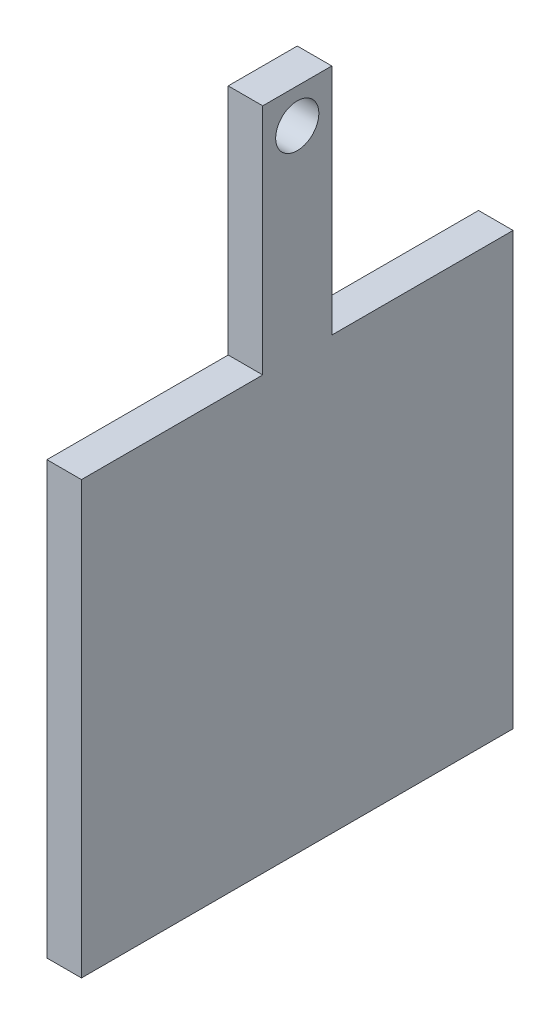
ISO-10303-21;
HEADER;
FILE_DESCRIPTION(('STEP AP214'),'2;1');
FILE_NAME('part.step','',(''),(''),'','','');
FILE_SCHEMA(('AUTOMOTIVE_DESIGN { 1 0 10303 214 1 1 1 1 }'));
ENDSEC;
DATA;
#1=APPLICATION_CONTEXT('core data for automotive mechanical design processes');
#2=APPLICATION_PROTOCOL_DEFINITION('international standard','automotive_design',2000,#1);
#3=PRODUCT_CONTEXT('',#1,'mechanical');
#4=PRODUCT('Part','Part','',(#3));
#5=PRODUCT_RELATED_PRODUCT_CATEGORY('part','',(#4));
#6=PRODUCT_DEFINITION_FORMATION('','',#4);
#7=PRODUCT_DEFINITION_CONTEXT('part definition',#1,'design');
#8=PRODUCT_DEFINITION('design','',#6,#7);
#9=PRODUCT_DEFINITION_SHAPE('','',#8);
#10=(LENGTH_UNIT() NAMED_UNIT(*) SI_UNIT(.MILLI.,.METRE.));
#11=(NAMED_UNIT(*) PLANE_ANGLE_UNIT() SI_UNIT($,.RADIAN.));
#12=(NAMED_UNIT(*) SI_UNIT($,.STERADIAN.) SOLID_ANGLE_UNIT());
#13=UNCERTAINTY_MEASURE_WITH_UNIT(LENGTH_MEASURE(1.E-05),#10,'distance_accuracy_value','');
#14=(GEOMETRIC_REPRESENTATION_CONTEXT(3) GLOBAL_UNCERTAINTY_ASSIGNED_CONTEXT((#13)) GLOBAL_UNIT_ASSIGNED_CONTEXT((#10,
#11,#12)) REPRESENTATION_CONTEXT('',''));
#15=CARTESIAN_POINT('',(0.,0.,0.));
#16=DIRECTION('',(0.,0.,1.));
#17=DIRECTION('',(1.,0.,0.));
#18=AXIS2_PLACEMENT_3D('',#15,#16,#17);
#19=CARTESIAN_POINT('',(4.,0.,0.));
#20=DIRECTION('',(1.,0.,0.));
#21=DIRECTION('',(0.,0.,-1.));
#22=AXIS2_PLACEMENT_3D('',#19,#20,#21);
#23=PLANE('',#22);
#24=DIRECTION('',(0.,0.,1.));
#25=VECTOR('',#24,1.);
#26=CARTESIAN_POINT('',(4.,0.,21.));
#27=LINE('',#26,#25);
#28=CARTESIAN_POINT('',(4.,0.,0.));
#29=VERTEX_POINT('',#28);
#30=CARTESIAN_POINT('',(4.,0.,21.));
#31=VERTEX_POINT('',#30);
#32=EDGE_CURVE('E144',#29,#31,#27,.T.);
#33=ORIENTED_EDGE('',*,*,#32,.T.);
#34=DIRECTION('',(0.,-1.,0.));
#35=VECTOR('',#34,1.);
#36=CARTESIAN_POINT('',(4.,-50.,21.));
#37=LINE('',#36,#35);
#38=CARTESIAN_POINT('',(4.,-50.,21.));
#39=VERTEX_POINT('',#38);
#40=EDGE_CURVE('E92',#31,#39,#37,.T.);
#41=ORIENTED_EDGE('',*,*,#40,.T.);
#42=DIRECTION('',(0.,0.,-1.));
#43=VECTOR('',#42,1.);
#44=CARTESIAN_POINT('',(4.,-50.,-29.));
#45=LINE('',#44,#43);
#46=CARTESIAN_POINT('',(4.,-50.,-29.));
#47=VERTEX_POINT('',#46);
#48=EDGE_CURVE('E159',#39,#47,#45,.T.);
#49=ORIENTED_EDGE('',*,*,#48,.T.);
#50=DIRECTION('',(0.,1.,0.));
#51=VECTOR('',#50,1.);
#52=CARTESIAN_POINT('',(4.,0.,-29.));
#53=LINE('',#52,#51);
#54=CARTESIAN_POINT('',(4.,0.,-29.));
#55=VERTEX_POINT('',#54);
#56=EDGE_CURVE('E172',#47,#55,#53,.T.);
#57=ORIENTED_EDGE('',*,*,#56,.T.);
#58=DIRECTION('',(0.,0.,1.));
#59=VECTOR('',#58,1.);
#60=CARTESIAN_POINT('',(4.,0.,-8.));
#61=LINE('',#60,#59);
#62=CARTESIAN_POINT('',(4.,0.,-8.));
#63=VERTEX_POINT('',#62);
#64=EDGE_CURVE('E111',#55,#63,#61,.T.);
#65=ORIENTED_EDGE('',*,*,#64,.T.);
#66=DIRECTION('',(0.,1.,0.));
#67=VECTOR('',#66,1.);
#68=CARTESIAN_POINT('',(4.,27.,-8.));
#69=LINE('',#68,#67);
#70=CARTESIAN_POINT('',(4.,27.,-8.));
#71=VERTEX_POINT('',#70);
#72=EDGE_CURVE('E105',#63,#71,#69,.T.);
#73=ORIENTED_EDGE('',*,*,#72,.T.);
#74=DIRECTION('',(0.,0.,1.));
#75=VECTOR('',#74,1.);
#76=CARTESIAN_POINT('',(4.,27.,0.));
#77=LINE('',#76,#75);
#78=CARTESIAN_POINT('',(4.,27.,0.));
#79=VERTEX_POINT('',#78);
#80=EDGE_CURVE('E109',#71,#79,#77,.T.);
#81=ORIENTED_EDGE('',*,*,#80,.T.);
#82=DIRECTION('',(0.,-1.,0.));
#83=VECTOR('',#82,1.);
#84=CARTESIAN_POINT('',(4.,0.,0.));
#85=LINE('',#84,#83);
#86=EDGE_CURVE('E49',#79,#29,#85,.T.);
#87=ORIENTED_EDGE('',*,*,#86,.T.);
#88=EDGE_LOOP('',(#33,#41,#49,#57,#65,#73,#81,#87));
#89=FACE_BOUND('',#88,.T.);
#90=CARTESIAN_POINT('',(4.,23.,-4.));
#91=DIRECTION('',(1.,0.,0.));
#92=DIRECTION('',(0.,0.,-1.));
#93=AXIS2_PLACEMENT_3D('',#90,#91,#92);
#94=CIRCLE('',#93,2.5);
#95=CARTESIAN_POINT('',(4.,23.,-6.5));
#96=VERTEX_POINT('',#95);
#97=EDGE_CURVE('E133',#96,#96,#94,.T.);
#98=ORIENTED_EDGE('',*,*,#97,.F.);
#99=EDGE_LOOP('',(#98));
#100=FACE_BOUND('',#99,.T.);
#101=ADVANCED_FACE('F32',(#89,#100),#23,.T.);
#102=CARTESIAN_POINT('',(0.,0.,0.));
#103=DIRECTION('',(1.,0.,0.));
#104=DIRECTION('',(0.,0.,-1.));
#105=AXIS2_PLACEMENT_3D('',#102,#103,#104);
#106=PLANE('',#105);
#107=DIRECTION('',(0.,0.,1.));
#108=VECTOR('',#107,1.);
#109=CARTESIAN_POINT('',(0.,0.,21.));
#110=LINE('',#109,#108);
#111=CARTESIAN_POINT('',(0.,0.,0.));
#112=VERTEX_POINT('',#111);
#113=CARTESIAN_POINT('',(0.,0.,21.));
#114=VERTEX_POINT('',#113);
#115=EDGE_CURVE('E129',#112,#114,#110,.T.);
#116=ORIENTED_EDGE('',*,*,#115,.F.);
#117=DIRECTION('',(0.,-1.,0.));
#118=VECTOR('',#117,1.);
#119=CARTESIAN_POINT('',(0.,0.,0.));
#120=LINE('',#119,#118);
#121=CARTESIAN_POINT('',(0.,27.,0.));
#122=VERTEX_POINT('',#121);
#123=EDGE_CURVE('E84',#122,#112,#120,.T.);
#124=ORIENTED_EDGE('',*,*,#123,.F.);
#125=DIRECTION('',(0.,0.,1.));
#126=VECTOR('',#125,1.);
#127=CARTESIAN_POINT('',(0.,27.,0.));
#128=LINE('',#127,#126);
#129=CARTESIAN_POINT('',(0.,27.,-8.));
#130=VERTEX_POINT('',#129);
#131=EDGE_CURVE('E78',#130,#122,#128,.T.);
#132=ORIENTED_EDGE('',*,*,#131,.F.);
#133=DIRECTION('',(0.,1.,0.));
#134=VECTOR('',#133,1.);
#135=CARTESIAN_POINT('',(0.,27.,-8.));
#136=LINE('',#135,#134);
#137=CARTESIAN_POINT('',(0.,0.,-8.));
#138=VERTEX_POINT('',#137);
#139=EDGE_CURVE('E119',#138,#130,#136,.T.);
#140=ORIENTED_EDGE('',*,*,#139,.F.);
#141=DIRECTION('',(0.,0.,1.));
#142=VECTOR('',#141,1.);
#143=CARTESIAN_POINT('',(0.,0.,-8.));
#144=LINE('',#143,#142);
#145=CARTESIAN_POINT('',(0.,0.,-29.));
#146=VERTEX_POINT('',#145);
#147=EDGE_CURVE('E139',#146,#138,#144,.T.);
#148=ORIENTED_EDGE('',*,*,#147,.F.);
#149=DIRECTION('',(0.,1.,0.));
#150=VECTOR('',#149,1.);
#151=CARTESIAN_POINT('',(0.,0.,-29.));
#152=LINE('',#151,#150);
#153=CARTESIAN_POINT('',(0.,-50.,-29.));
#154=VERTEX_POINT('',#153);
#155=EDGE_CURVE('E137',#154,#146,#152,.T.);
#156=ORIENTED_EDGE('',*,*,#155,.F.);
#157=DIRECTION('',(0.,0.,-1.));
#158=VECTOR('',#157,1.);
#159=CARTESIAN_POINT('',(0.,-50.,-29.));
#160=LINE('',#159,#158);
#161=CARTESIAN_POINT('',(0.,-50.,21.));
#162=VERTEX_POINT('',#161);
#163=EDGE_CURVE('E135',#162,#154,#160,.T.);
#164=ORIENTED_EDGE('',*,*,#163,.F.);
#165=DIRECTION('',(0.,-1.,0.));
#166=VECTOR('',#165,1.);
#167=CARTESIAN_POINT('',(0.,-50.,21.));
#168=LINE('',#167,#166);
#169=EDGE_CURVE('E132',#114,#162,#168,.T.);
#170=ORIENTED_EDGE('',*,*,#169,.F.);
#171=EDGE_LOOP('',(#116,#124,#132,#140,#148,#156,#164,#170));
#172=FACE_BOUND('',#171,.T.);
#173=CARTESIAN_POINT('',(0.,23.,-4.));
#174=DIRECTION('',(1.,0.,0.));
#175=DIRECTION('',(0.,0.,-1.));
#176=AXIS2_PLACEMENT_3D('',#173,#174,#175);
#177=CIRCLE('',#176,2.5);
#178=CARTESIAN_POINT('',(0.,23.,-6.5));
#179=VERTEX_POINT('',#178);
#180=EDGE_CURVE('E178',#179,#179,#177,.T.);
#181=ORIENTED_EDGE('',*,*,#180,.T.);
#182=EDGE_LOOP('',(#181));
#183=FACE_BOUND('',#182,.T.);
#184=ADVANCED_FACE('F163',(#172,#183),#106,.F.);
#185=CARTESIAN_POINT('',(4.,0.,21.));
#186=DIRECTION('',(0.,-1.,0.));
#187=DIRECTION('',(0.,0.,-1.));
#188=AXIS2_PLACEMENT_3D('',#185,#186,#187);
#189=PLANE('',#188);
#190=ORIENTED_EDGE('',*,*,#115,.T.);
#191=DIRECTION('',(-1.,0.,0.));
#192=VECTOR('',#191,1.);
#193=CARTESIAN_POINT('',(4.,0.,21.));
#194=LINE('',#193,#192);
#195=EDGE_CURVE('E11',#31,#114,#194,.T.);
#196=ORIENTED_EDGE('',*,*,#195,.F.);
#197=ORIENTED_EDGE('',*,*,#32,.F.);
#198=DIRECTION('',(-1.,0.,0.));
#199=VECTOR('',#198,1.);
#200=CARTESIAN_POINT('',(4.,0.,0.));
#201=LINE('',#200,#199);
#202=EDGE_CURVE('E125',#29,#112,#201,.T.);
#203=ORIENTED_EDGE('',*,*,#202,.T.);
#204=EDGE_LOOP('',(#190,#196,#197,#203));
#205=FACE_BOUND('',#204,.T.);
#206=ADVANCED_FACE('F34',(#205),#189,.F.);
#207=CARTESIAN_POINT('',(4.,-50.,21.));
#208=DIRECTION('',(0.,0.,-1.));
#209=DIRECTION('',(-1.,0.,0.));
#210=AXIS2_PLACEMENT_3D('',#207,#208,#209);
#211=PLANE('',#210);
#212=ORIENTED_EDGE('',*,*,#169,.T.);
#213=DIRECTION('',(-1.,0.,0.));
#214=VECTOR('',#213,1.);
#215=CARTESIAN_POINT('',(4.,-50.,21.));
#216=LINE('',#215,#214);
#217=EDGE_CURVE('E41',#39,#162,#216,.T.);
#218=ORIENTED_EDGE('',*,*,#217,.F.);
#219=ORIENTED_EDGE('',*,*,#40,.F.);
#220=ORIENTED_EDGE('',*,*,#195,.T.);
#221=EDGE_LOOP('',(#212,#218,#219,#220));
#222=FACE_BOUND('',#221,.T.);
#223=ADVANCED_FACE('F206',(#222),#211,.F.);
#224=CARTESIAN_POINT('',(4.,-50.,-29.));
#225=DIRECTION('',(0.,1.,0.));
#226=DIRECTION('',(0.,0.,1.));
#227=AXIS2_PLACEMENT_3D('',#224,#225,#226);
#228=PLANE('',#227);
#229=ORIENTED_EDGE('',*,*,#163,.T.);
#230=DIRECTION('',(-1.,0.,0.));
#231=VECTOR('',#230,1.);
#232=CARTESIAN_POINT('',(4.,-50.,-29.));
#233=LINE('',#232,#231);
#234=EDGE_CURVE('E151',#47,#154,#233,.T.);
#235=ORIENTED_EDGE('',*,*,#234,.F.);
#236=ORIENTED_EDGE('',*,*,#48,.F.);
#237=ORIENTED_EDGE('',*,*,#217,.T.);
#238=EDGE_LOOP('',(#229,#235,#236,#237));
#239=FACE_BOUND('',#238,.T.);
#240=ADVANCED_FACE('F157',(#239),#228,.F.);
#241=CARTESIAN_POINT('',(4.,0.,-29.));
#242=DIRECTION('',(0.,0.,1.));
#243=DIRECTION('',(0.,-1.,0.));
#244=AXIS2_PLACEMENT_3D('',#241,#242,#243);
#245=PLANE('',#244);
#246=ORIENTED_EDGE('',*,*,#155,.T.);
#247=DIRECTION('',(-1.,0.,0.));
#248=VECTOR('',#247,1.);
#249=CARTESIAN_POINT('',(4.,0.,-29.));
#250=LINE('',#249,#248);
#251=EDGE_CURVE('E148',#55,#146,#250,.T.);
#252=ORIENTED_EDGE('',*,*,#251,.F.);
#253=ORIENTED_EDGE('',*,*,#56,.F.);
#254=ORIENTED_EDGE('',*,*,#234,.T.);
#255=EDGE_LOOP('',(#246,#252,#253,#254));
#256=FACE_BOUND('',#255,.T.);
#257=ADVANCED_FACE('F168',(#256),#245,.F.);
#258=CARTESIAN_POINT('',(4.,0.,-8.));
#259=DIRECTION('',(0.,-1.,0.));
#260=DIRECTION('',(0.,0.,-1.));
#261=AXIS2_PLACEMENT_3D('',#258,#259,#260);
#262=PLANE('',#261);
#263=ORIENTED_EDGE('',*,*,#147,.T.);
#264=DIRECTION('',(-1.,0.,0.));
#265=VECTOR('',#264,1.);
#266=CARTESIAN_POINT('',(4.,0.,-8.));
#267=LINE('',#266,#265);
#268=EDGE_CURVE('E120',#63,#138,#267,.T.);
#269=ORIENTED_EDGE('',*,*,#268,.F.);
#270=ORIENTED_EDGE('',*,*,#64,.F.);
#271=ORIENTED_EDGE('',*,*,#251,.T.);
#272=EDGE_LOOP('',(#263,#269,#270,#271));
#273=FACE_BOUND('',#272,.T.);
#274=ADVANCED_FACE('F171',(#273),#262,.F.);
#275=CARTESIAN_POINT('',(4.,27.,-8.));
#276=DIRECTION('',(0.,0.,1.));
#277=DIRECTION('',(0.,-1.,0.));
#278=AXIS2_PLACEMENT_3D('',#275,#276,#277);
#279=PLANE('',#278);
#280=ORIENTED_EDGE('',*,*,#139,.T.);
#281=DIRECTION('',(-1.,0.,0.));
#282=VECTOR('',#281,1.);
#283=CARTESIAN_POINT('',(4.,27.,-8.));
#284=LINE('',#283,#282);
#285=EDGE_CURVE('E116',#71,#130,#284,.T.);
#286=ORIENTED_EDGE('',*,*,#285,.F.);
#287=ORIENTED_EDGE('',*,*,#72,.F.);
#288=ORIENTED_EDGE('',*,*,#268,.T.);
#289=EDGE_LOOP('',(#280,#286,#287,#288));
#290=FACE_BOUND('',#289,.T.);
#291=ADVANCED_FACE('F117',(#290),#279,.F.);
#292=CARTESIAN_POINT('',(4.,27.,0.));
#293=DIRECTION('',(0.,-1.,0.));
#294=DIRECTION('',(0.,0.,-1.));
#295=AXIS2_PLACEMENT_3D('',#292,#293,#294);
#296=PLANE('',#295);
#297=ORIENTED_EDGE('',*,*,#131,.T.);
#298=DIRECTION('',(-1.,0.,0.));
#299=VECTOR('',#298,1.);
#300=CARTESIAN_POINT('',(4.,27.,0.));
#301=LINE('',#300,#299);
#302=EDGE_CURVE('E121',#79,#122,#301,.T.);
#303=ORIENTED_EDGE('',*,*,#302,.F.);
#304=ORIENTED_EDGE('',*,*,#80,.F.);
#305=ORIENTED_EDGE('',*,*,#285,.T.);
#306=EDGE_LOOP('',(#297,#303,#304,#305));
#307=FACE_BOUND('',#306,.T.);
#308=ADVANCED_FACE('F123',(#307),#296,.F.);
#309=CARTESIAN_POINT('',(4.,0.,0.));
#310=DIRECTION('',(0.,0.,-1.));
#311=DIRECTION('',(-1.,0.,0.));
#312=AXIS2_PLACEMENT_3D('',#309,#310,#311);
#313=PLANE('',#312);
#314=ORIENTED_EDGE('',*,*,#123,.T.);
#315=ORIENTED_EDGE('',*,*,#202,.F.);
#316=ORIENTED_EDGE('',*,*,#86,.F.);
#317=ORIENTED_EDGE('',*,*,#302,.T.);
#318=EDGE_LOOP('',(#314,#315,#316,#317));
#319=FACE_BOUND('',#318,.T.);
#320=ADVANCED_FACE('F194',(#319),#313,.F.);
#321=CARTESIAN_POINT('',(4.,23.,-4.));
#322=DIRECTION('',(-1.,0.,0.));
#323=DIRECTION('',(0.,0.,1.));
#324=AXIS2_PLACEMENT_3D('',#321,#322,#323);
#325=CYLINDRICAL_SURFACE('',#324,2.5);
#326=ORIENTED_EDGE('',*,*,#97,.T.);
#327=EDGE_LOOP('',(#326));
#328=FACE_BOUND('',#327,.T.);
#329=ORIENTED_EDGE('',*,*,#180,.F.);
#330=EDGE_LOOP('',(#329));
#331=FACE_BOUND('',#330,.T.);
#332=ADVANCED_FACE('F184',(#328,#331),#325,.F.);
#333=CLOSED_SHELL('',(#101,#184,#206,#223,#240,#257,#274,#291,#308,#320,#332));
#334=MANIFOLD_SOLID_BREP('B2',#333);
#335=ADVANCED_BREP_SHAPE_REPRESENTATION('',(#18,#334),#14);
#336=SHAPE_DEFINITION_REPRESENTATION(#9,#335);
ENDSEC;
END-ISO-10303-21;
